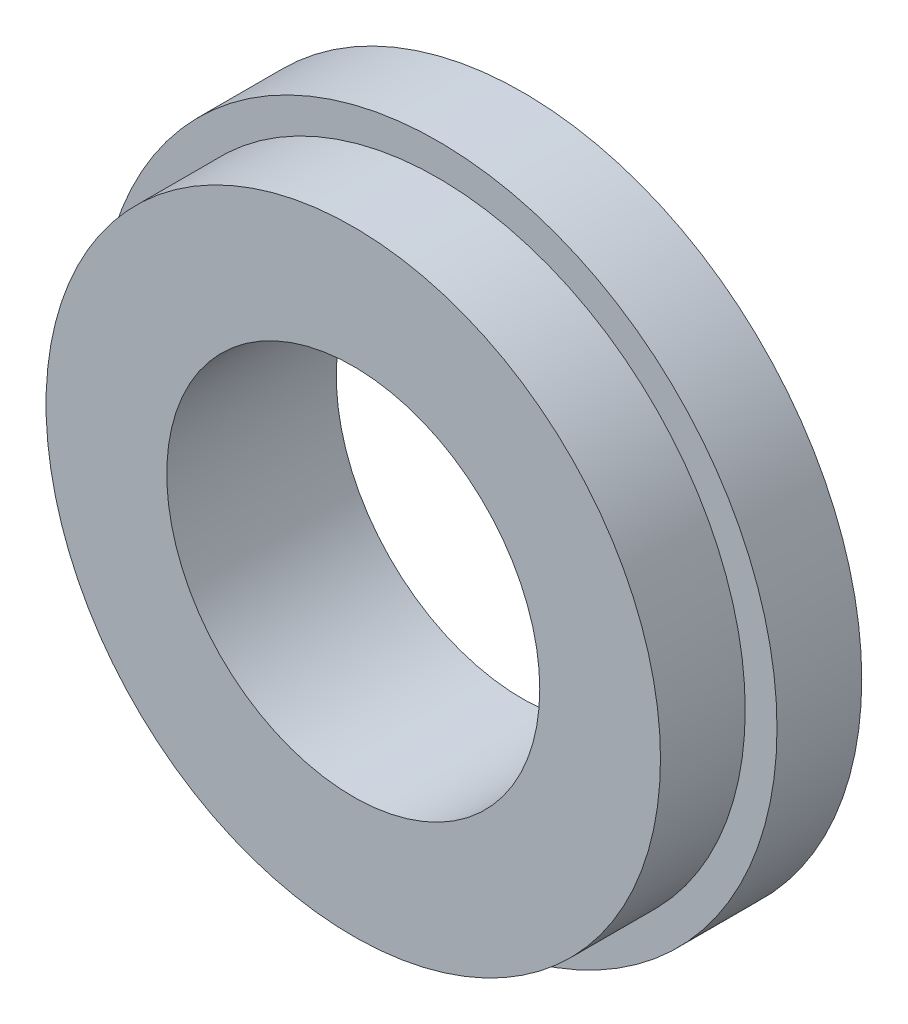
ISO-10303-21;
HEADER;
FILE_DESCRIPTION(('STEP AP214'),'2;1');
FILE_NAME('part.step','',(''),(''),'','','');
FILE_SCHEMA(('AUTOMOTIVE_DESIGN { 1 0 10303 214 1 1 1 1 }'));
ENDSEC;
DATA;
#1=APPLICATION_CONTEXT('core data for automotive mechanical design processes');
#2=APPLICATION_PROTOCOL_DEFINITION('international standard','automotive_design',2000,#1);
#3=PRODUCT_CONTEXT('',#1,'mechanical');
#4=PRODUCT('Part','Part','',(#3));
#5=PRODUCT_RELATED_PRODUCT_CATEGORY('part','',(#4));
#6=PRODUCT_DEFINITION_FORMATION('','',#4);
#7=PRODUCT_DEFINITION_CONTEXT('part definition',#1,'design');
#8=PRODUCT_DEFINITION('design','',#6,#7);
#9=PRODUCT_DEFINITION_SHAPE('','',#8);
#10=(LENGTH_UNIT() NAMED_UNIT(*) SI_UNIT(.MILLI.,.METRE.));
#11=(NAMED_UNIT(*) PLANE_ANGLE_UNIT() SI_UNIT($,.RADIAN.));
#12=(NAMED_UNIT(*) SI_UNIT($,.STERADIAN.) SOLID_ANGLE_UNIT());
#13=UNCERTAINTY_MEASURE_WITH_UNIT(LENGTH_MEASURE(1.E-05),#10,'distance_accuracy_value','');
#14=(GEOMETRIC_REPRESENTATION_CONTEXT(3) GLOBAL_UNCERTAINTY_ASSIGNED_CONTEXT((#13)) GLOBAL_UNIT_ASSIGNED_CONTEXT((#10,
#11,#12)) REPRESENTATION_CONTEXT('',''));
#15=CARTESIAN_POINT('',(0.,0.,0.));
#16=DIRECTION('',(0.,0.,1.));
#17=DIRECTION('',(1.,0.,0.));
#18=AXIS2_PLACEMENT_3D('',#15,#16,#17);
#19=CARTESIAN_POINT('',(0.,0.,0.));
#20=DIRECTION('',(0.,0.,1.));
#21=DIRECTION('',(1.,0.,0.));
#22=AXIS2_PLACEMENT_3D('',#19,#20,#21);
#23=CYLINDRICAL_SURFACE('',#22,27.9486279941417);
#24=CARTESIAN_POINT('',(0.,0.,-25.4));
#25=DIRECTION('',(0.,0.,1.));
#26=DIRECTION('',(1.,0.,0.));
#27=AXIS2_PLACEMENT_3D('',#24,#25,#26);
#28=CIRCLE('',#27,27.9486279941417);
#29=CARTESIAN_POINT('',(27.9486279941417,0.,-25.4));
#30=VERTEX_POINT('',#29);
#31=EDGE_CURVE('E10',#30,#30,#28,.T.);
#32=ORIENTED_EDGE('',*,*,#31,.F.);
#33=EDGE_LOOP('',(#32));
#34=FACE_BOUND('',#33,.T.);
#35=CARTESIAN_POINT('',(0.,0.,0.));
#36=DIRECTION('',(0.,0.,1.));
#37=DIRECTION('',(1.,0.,0.));
#38=AXIS2_PLACEMENT_3D('',#35,#36,#37);
#39=CIRCLE('',#38,27.9486279941417);
#40=CARTESIAN_POINT('',(27.9486279941417,0.,0.));
#41=VERTEX_POINT('',#40);
#42=EDGE_CURVE('E54',#41,#41,#39,.T.);
#43=ORIENTED_EDGE('',*,*,#42,.T.);
#44=EDGE_LOOP('',(#43));
#45=FACE_BOUND('',#44,.T.);
#46=ADVANCED_FACE('F32',(#34,#45),#23,.F.);
#47=CARTESIAN_POINT('',(0.,0.,-25.4));
#48=DIRECTION('',(0.,0.,1.));
#49=DIRECTION('',(1.,0.,0.));
#50=AXIS2_PLACEMENT_3D('',#47,#48,#49);
#51=PLANE('',#50);
#52=CARTESIAN_POINT('',(0.,0.,-25.4));
#53=DIRECTION('',(0.,0.,1.));
#54=DIRECTION('',(1.,0.,0.));
#55=AXIS2_PLACEMENT_3D('',#52,#53,#54);
#56=CIRCLE('',#55,50.8);
#57=CARTESIAN_POINT('',(50.8,0.,-25.4));
#58=VERTEX_POINT('',#57);
#59=EDGE_CURVE('E38',#58,#58,#56,.T.);
#60=ORIENTED_EDGE('',*,*,#59,.F.);
#61=EDGE_LOOP('',(#60));
#62=FACE_BOUND('',#61,.T.);
#63=ORIENTED_EDGE('',*,*,#31,.T.);
#64=EDGE_LOOP('',(#63));
#65=FACE_BOUND('',#64,.T.);
#66=ADVANCED_FACE('F71',(#62,#65),#51,.F.);
#67=CARTESIAN_POINT('',(0.,0.,0.));
#68=DIRECTION('',(0.,0.,1.));
#69=DIRECTION('',(1.,0.,0.));
#70=AXIS2_PLACEMENT_3D('',#67,#68,#69);
#71=CYLINDRICAL_SURFACE('',#70,50.8);
#72=ORIENTED_EDGE('',*,*,#59,.T.);
#73=EDGE_LOOP('',(#72));
#74=FACE_BOUND('',#73,.T.);
#75=CARTESIAN_POINT('',(0.,0.,-12.7));
#76=DIRECTION('',(0.,0.,1.));
#77=DIRECTION('',(1.,0.,0.));
#78=AXIS2_PLACEMENT_3D('',#75,#76,#77);
#79=CIRCLE('',#78,50.8);
#80=CARTESIAN_POINT('',(50.8,0.,-12.7));
#81=VERTEX_POINT('',#80);
#82=EDGE_CURVE('E42',#81,#81,#79,.T.);
#83=ORIENTED_EDGE('',*,*,#82,.F.);
#84=EDGE_LOOP('',(#83));
#85=FACE_BOUND('',#84,.T.);
#86=ADVANCED_FACE('F76',(#74,#85),#71,.T.);
#87=CARTESIAN_POINT('',(0.,0.,-12.7));
#88=DIRECTION('',(0.,0.,1.));
#89=DIRECTION('',(1.,0.,0.));
#90=AXIS2_PLACEMENT_3D('',#87,#88,#89);
#91=PLANE('',#90);
#92=ORIENTED_EDGE('',*,*,#82,.T.);
#93=EDGE_LOOP('',(#92));
#94=FACE_BOUND('',#93,.T.);
#95=CARTESIAN_POINT('',(0.,0.,-12.7));
#96=DIRECTION('',(0.,0.,1.));
#97=DIRECTION('',(1.,0.,0.));
#98=AXIS2_PLACEMENT_3D('',#95,#96,#97);
#99=CIRCLE('',#98,46.0375);
#100=CARTESIAN_POINT('',(46.0375,0.,-12.7));
#101=VERTEX_POINT('',#100);
#102=EDGE_CURVE('E46',#101,#101,#99,.T.);
#103=ORIENTED_EDGE('',*,*,#102,.F.);
#104=EDGE_LOOP('',(#103));
#105=FACE_BOUND('',#104,.T.);
#106=ADVANCED_FACE('F67',(#94,#105),#91,.T.);
#107=CARTESIAN_POINT('',(0.,0.,0.));
#108=DIRECTION('',(0.,0.,1.));
#109=DIRECTION('',(1.,0.,0.));
#110=AXIS2_PLACEMENT_3D('',#107,#108,#109);
#111=CYLINDRICAL_SURFACE('',#110,46.0375);
#112=ORIENTED_EDGE('',*,*,#102,.T.);
#113=EDGE_LOOP('',(#112));
#114=FACE_BOUND('',#113,.T.);
#115=CARTESIAN_POINT('',(0.,0.,0.));
#116=DIRECTION('',(0.,0.,1.));
#117=DIRECTION('',(1.,0.,0.));
#118=AXIS2_PLACEMENT_3D('',#115,#116,#117);
#119=CIRCLE('',#118,46.0375);
#120=CARTESIAN_POINT('',(46.0375,0.,0.));
#121=VERTEX_POINT('',#120);
#122=EDGE_CURVE('E51',#121,#121,#119,.T.);
#123=ORIENTED_EDGE('',*,*,#122,.F.);
#124=EDGE_LOOP('',(#123));
#125=FACE_BOUND('',#124,.T.);
#126=ADVANCED_FACE('F61',(#114,#125),#111,.T.);
#127=CARTESIAN_POINT('',(0.,0.,0.));
#128=DIRECTION('',(0.,0.,1.));
#129=DIRECTION('',(1.,0.,0.));
#130=AXIS2_PLACEMENT_3D('',#127,#128,#129);
#131=PLANE('',#130);
#132=ORIENTED_EDGE('',*,*,#122,.T.);
#133=EDGE_LOOP('',(#132));
#134=FACE_BOUND('',#133,.T.);
#135=ORIENTED_EDGE('',*,*,#42,.F.);
#136=EDGE_LOOP('',(#135));
#137=FACE_BOUND('',#136,.T.);
#138=ADVANCED_FACE('F59',(#134,#137),#131,.T.);
#139=CLOSED_SHELL('',(#46,#66,#86,#106,#126,#138));
#140=MANIFOLD_SOLID_BREP('B2',#139);
#141=ADVANCED_BREP_SHAPE_REPRESENTATION('',(#18,#140),#14);
#142=SHAPE_DEFINITION_REPRESENTATION(#9,#141);
ENDSEC;
END-ISO-10303-21;
